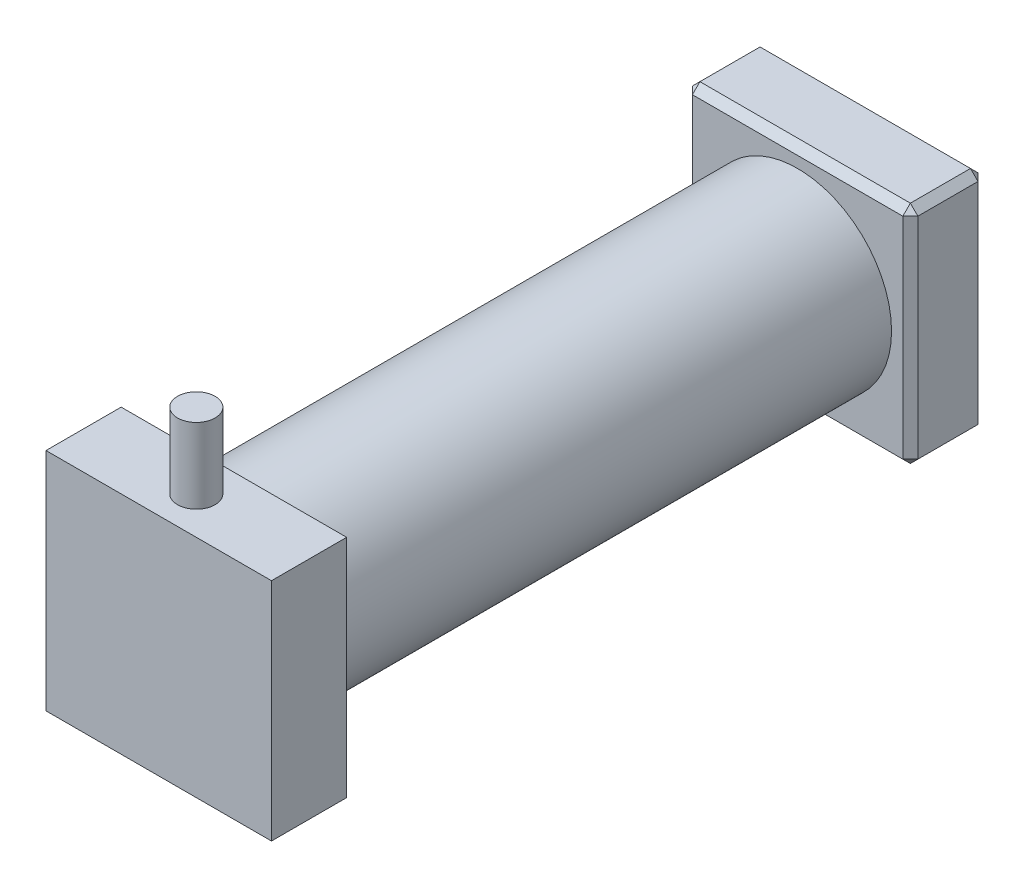
ISO-10303-21;
HEADER;
FILE_DESCRIPTION(('STEP AP214'),'2;1');
FILE_NAME('part.step','',(''),(''),'','','');
FILE_SCHEMA(('AUTOMOTIVE_DESIGN { 1 0 10303 214 1 1 1 1 }'));
ENDSEC;
DATA;
#1=APPLICATION_CONTEXT('core data for automotive mechanical design processes');
#2=APPLICATION_PROTOCOL_DEFINITION('international standard','automotive_design',2000,#1);
#3=PRODUCT_CONTEXT('',#1,'mechanical');
#4=PRODUCT('Part','Part','',(#3));
#5=PRODUCT_RELATED_PRODUCT_CATEGORY('part','',(#4));
#6=PRODUCT_DEFINITION_FORMATION('','',#4);
#7=PRODUCT_DEFINITION_CONTEXT('part definition',#1,'design');
#8=PRODUCT_DEFINITION('design','',#6,#7);
#9=PRODUCT_DEFINITION_SHAPE('','',#8);
#10=(LENGTH_UNIT() NAMED_UNIT(*) SI_UNIT(.MILLI.,.METRE.));
#11=(NAMED_UNIT(*) PLANE_ANGLE_UNIT() SI_UNIT($,.RADIAN.));
#12=(NAMED_UNIT(*) SI_UNIT($,.STERADIAN.) SOLID_ANGLE_UNIT());
#13=UNCERTAINTY_MEASURE_WITH_UNIT(LENGTH_MEASURE(1.E-05),#10,'distance_accuracy_value','');
#14=(GEOMETRIC_REPRESENTATION_CONTEXT(3) GLOBAL_UNCERTAINTY_ASSIGNED_CONTEXT((#13)) GLOBAL_UNIT_ASSIGNED_CONTEXT((#10,
#11,#12)) REPRESENTATION_CONTEXT('',''));
#15=CARTESIAN_POINT('',(0.,0.,0.));
#16=DIRECTION('',(0.,0.,1.));
#17=DIRECTION('',(1.,0.,0.));
#18=AXIS2_PLACEMENT_3D('',#15,#16,#17);
#19=CARTESIAN_POINT('',(0.,0.,150.));
#20=DIRECTION('',(0.,0.,-1.));
#21=DIRECTION('',(-1.,0.,0.));
#22=AXIS2_PLACEMENT_3D('',#19,#20,#21);
#23=CYLINDRICAL_SURFACE('',#22,25.);
#24=CARTESIAN_POINT('',(0.,0.,150.));
#25=DIRECTION('',(0.,0.,1.));
#26=DIRECTION('',(1.,0.,0.));
#27=AXIS2_PLACEMENT_3D('',#24,#25,#26);
#28=CIRCLE('',#27,25.);
#29=CARTESIAN_POINT('',(25.,0.,150.));
#30=VERTEX_POINT('',#29);
#31=EDGE_CURVE('E64',#30,#30,#28,.T.);
#32=ORIENTED_EDGE('',*,*,#31,.F.);
#33=EDGE_LOOP('',(#32));
#34=FACE_BOUND('',#33,.T.);
#35=CARTESIAN_POINT('',(0.,0.,0.));
#36=DIRECTION('',(0.,0.,1.));
#37=DIRECTION('',(1.,0.,0.));
#38=AXIS2_PLACEMENT_3D('',#35,#36,#37);
#39=CIRCLE('',#38,25.);
#40=CARTESIAN_POINT('',(25.,0.,0.));
#41=VERTEX_POINT('',#40);
#42=EDGE_CURVE('E60',#41,#41,#39,.T.);
#43=ORIENTED_EDGE('',*,*,#42,.T.);
#44=EDGE_LOOP('',(#43));
#45=FACE_BOUND('',#44,.T.);
#46=ADVANCED_FACE('F52',(#34,#45),#23,.T.);
#47=CARTESIAN_POINT('',(30.,-30.,170.));
#48=DIRECTION('',(-1.,0.,0.));
#49=DIRECTION('',(0.,0.,1.));
#50=AXIS2_PLACEMENT_3D('',#47,#48,#49);
#51=PLANE('',#50);
#52=DIRECTION('',(0.,1.,0.));
#53=VECTOR('',#52,1.);
#54=CARTESIAN_POINT('',(30.,-30.,150.));
#55=LINE('',#54,#53);
#56=CARTESIAN_POINT('',(30.,-30.,150.));
#57=VERTEX_POINT('',#56);
#58=CARTESIAN_POINT('',(30.,30.,150.));
#59=VERTEX_POINT('',#58);
#60=EDGE_CURVE('E121',#57,#59,#55,.T.);
#61=ORIENTED_EDGE('',*,*,#60,.T.);
#62=DIRECTION('',(0.,0.,-1.));
#63=VECTOR('',#62,1.);
#64=CARTESIAN_POINT('',(30.,30.,170.));
#65=LINE('',#64,#63);
#66=CARTESIAN_POINT('',(30.,30.,170.));
#67=VERTEX_POINT('',#66);
#68=EDGE_CURVE('E108',#67,#59,#65,.T.);
#69=ORIENTED_EDGE('',*,*,#68,.F.);
#70=DIRECTION('',(0.,1.,0.));
#71=VECTOR('',#70,1.);
#72=CARTESIAN_POINT('',(30.,-30.,170.));
#73=LINE('',#72,#71);
#74=CARTESIAN_POINT('',(30.,-30.,170.));
#75=VERTEX_POINT('',#74);
#76=EDGE_CURVE('E130',#75,#67,#73,.T.);
#77=ORIENTED_EDGE('',*,*,#76,.F.);
#78=DIRECTION('',(0.,0.,-1.));
#79=VECTOR('',#78,1.);
#80=CARTESIAN_POINT('',(30.,-30.,170.));
#81=LINE('',#80,#79);
#82=EDGE_CURVE('E112',#75,#57,#81,.T.);
#83=ORIENTED_EDGE('',*,*,#82,.T.);
#84=EDGE_LOOP('',(#61,#69,#77,#83));
#85=FACE_BOUND('',#84,.T.);
#86=ADVANCED_FACE('F134',(#85),#51,.F.);
#87=CARTESIAN_POINT('',(-30.,30.,170.));
#88=DIRECTION('',(0.,-1.,0.));
#89=DIRECTION('',(0.,0.,-1.));
#90=AXIS2_PLACEMENT_3D('',#87,#88,#89);
#91=PLANE('',#90);
#92=CARTESIAN_POINT('',(0.,30.,160.));
#93=DIRECTION('',(0.,1.,0.));
#94=DIRECTION('',(0.,0.,1.));
#95=AXIS2_PLACEMENT_3D('',#92,#93,#94);
#96=CIRCLE('',#95,5.);
#97=CARTESIAN_POINT('',(0.,30.,165.));
#98=VERTEX_POINT('',#97);
#99=EDGE_CURVE('E12',#98,#98,#96,.T.);
#100=ORIENTED_EDGE('',*,*,#99,.F.);
#101=EDGE_LOOP('',(#100));
#102=FACE_BOUND('',#101,.T.);
#103=DIRECTION('',(-1.,0.,0.));
#104=VECTOR('',#103,1.);
#105=CARTESIAN_POINT('',(-30.,30.,150.));
#106=LINE('',#105,#104);
#107=CARTESIAN_POINT('',(-30.,30.,150.));
#108=VERTEX_POINT('',#107);
#109=EDGE_CURVE('E75',#59,#108,#106,.T.);
#110=ORIENTED_EDGE('',*,*,#109,.T.);
#111=DIRECTION('',(0.,0.,-1.));
#112=VECTOR('',#111,1.);
#113=CARTESIAN_POINT('',(-30.,30.,170.));
#114=LINE('',#113,#112);
#115=CARTESIAN_POINT('',(-30.,30.,170.));
#116=VERTEX_POINT('',#115);
#117=EDGE_CURVE('E106',#116,#108,#114,.T.);
#118=ORIENTED_EDGE('',*,*,#117,.F.);
#119=DIRECTION('',(-1.,0.,0.));
#120=VECTOR('',#119,1.);
#121=CARTESIAN_POINT('',(-30.,30.,170.));
#122=LINE('',#121,#120);
#123=EDGE_CURVE('E86',#67,#116,#122,.T.);
#124=ORIENTED_EDGE('',*,*,#123,.F.);
#125=ORIENTED_EDGE('',*,*,#68,.T.);
#126=EDGE_LOOP('',(#110,#118,#124,#125));
#127=FACE_BOUND('',#126,.T.);
#128=ADVANCED_FACE('F104',(#102,#127),#91,.F.);
#129=CARTESIAN_POINT('',(-30.,-30.,170.));
#130=DIRECTION('',(1.,0.,0.));
#131=DIRECTION('',(0.,0.,-1.));
#132=AXIS2_PLACEMENT_3D('',#129,#130,#131);
#133=PLANE('',#132);
#134=DIRECTION('',(0.,-1.,0.));
#135=VECTOR('',#134,1.);
#136=CARTESIAN_POINT('',(-30.,-30.,150.));
#137=LINE('',#136,#135);
#138=CARTESIAN_POINT('',(-30.,-30.,150.));
#139=VERTEX_POINT('',#138);
#140=EDGE_CURVE('E103',#108,#139,#137,.T.);
#141=ORIENTED_EDGE('',*,*,#140,.T.);
#142=DIRECTION('',(0.,0.,-1.));
#143=VECTOR('',#142,1.);
#144=CARTESIAN_POINT('',(-30.,-30.,170.));
#145=LINE('',#144,#143);
#146=CARTESIAN_POINT('',(-30.,-30.,170.));
#147=VERTEX_POINT('',#146);
#148=EDGE_CURVE('E126',#147,#139,#145,.T.);
#149=ORIENTED_EDGE('',*,*,#148,.F.);
#150=DIRECTION('',(0.,-1.,0.));
#151=VECTOR('',#150,1.);
#152=CARTESIAN_POINT('',(-30.,-30.,170.));
#153=LINE('',#152,#151);
#154=EDGE_CURVE('E111',#116,#147,#153,.T.);
#155=ORIENTED_EDGE('',*,*,#154,.F.);
#156=ORIENTED_EDGE('',*,*,#117,.T.);
#157=EDGE_LOOP('',(#141,#149,#155,#156));
#158=FACE_BOUND('',#157,.T.);
#159=ADVANCED_FACE('F114',(#158),#133,.F.);
#160=CARTESIAN_POINT('',(-30.,-30.,170.));
#161=DIRECTION('',(0.,1.,0.));
#162=DIRECTION('',(0.,0.,1.));
#163=AXIS2_PLACEMENT_3D('',#160,#161,#162);
#164=PLANE('',#163);
#165=DIRECTION('',(1.,0.,0.));
#166=VECTOR('',#165,1.);
#167=CARTESIAN_POINT('',(-30.,-30.,150.));
#168=LINE('',#167,#166);
#169=EDGE_CURVE('E100',#139,#57,#168,.T.);
#170=ORIENTED_EDGE('',*,*,#169,.T.);
#171=ORIENTED_EDGE('',*,*,#82,.F.);
#172=DIRECTION('',(1.,0.,0.));
#173=VECTOR('',#172,1.);
#174=CARTESIAN_POINT('',(-30.,-30.,170.));
#175=LINE('',#174,#173);
#176=EDGE_CURVE('E123',#147,#75,#175,.T.);
#177=ORIENTED_EDGE('',*,*,#176,.F.);
#178=ORIENTED_EDGE('',*,*,#148,.T.);
#179=EDGE_LOOP('',(#170,#171,#177,#178));
#180=FACE_BOUND('',#179,.T.);
#181=ADVANCED_FACE('F133',(#180),#164,.F.);
#182=CARTESIAN_POINT('',(0.,0.,170.));
#183=DIRECTION('',(0.,0.,-1.));
#184=DIRECTION('',(-1.,0.,0.));
#185=AXIS2_PLACEMENT_3D('',#182,#183,#184);
#186=PLANE('',#185);
#187=ORIENTED_EDGE('',*,*,#76,.T.);
#188=ORIENTED_EDGE('',*,*,#123,.T.);
#189=ORIENTED_EDGE('',*,*,#154,.T.);
#190=ORIENTED_EDGE('',*,*,#176,.T.);
#191=EDGE_LOOP('',(#187,#188,#189,#190));
#192=FACE_BOUND('',#191,.T.);
#193=ADVANCED_FACE('F135',(#192),#186,.F.);
#194=CARTESIAN_POINT('',(0.,0.,150.));
#195=DIRECTION('',(0.,0.,-1.));
#196=DIRECTION('',(-1.,0.,0.));
#197=AXIS2_PLACEMENT_3D('',#194,#195,#196);
#198=PLANE('',#197);
#199=ORIENTED_EDGE('',*,*,#31,.T.);
#200=EDGE_LOOP('',(#199));
#201=FACE_BOUND('',#200,.T.);
#202=ORIENTED_EDGE('',*,*,#60,.F.);
#203=ORIENTED_EDGE('',*,*,#169,.F.);
#204=ORIENTED_EDGE('',*,*,#140,.F.);
#205=ORIENTED_EDGE('',*,*,#109,.F.);
#206=EDGE_LOOP('',(#202,#203,#204,#205));
#207=FACE_BOUND('',#206,.T.);
#208=ADVANCED_FACE('F116',(#201,#207),#198,.T.);
#209=CARTESIAN_POINT('',(0.,0.,0.));
#210=DIRECTION('',(0.,0.,1.));
#211=DIRECTION('',(1.,0.,0.));
#212=AXIS2_PLACEMENT_3D('',#209,#210,#211);
#213=PLANE('',#212);
#214=ORIENTED_EDGE('',*,*,#42,.F.);
#215=EDGE_LOOP('',(#214));
#216=FACE_BOUND('',#215,.T.);
#217=ADVANCED_FACE('F54',(#216),#213,.F.);
#218=CARTESIAN_POINT('',(0.,50.,160.));
#219=DIRECTION('',(0.,-1.,0.));
#220=DIRECTION('',(0.,0.,-1.));
#221=AXIS2_PLACEMENT_3D('',#218,#219,#220);
#222=CYLINDRICAL_SURFACE('',#221,5.);
#223=CARTESIAN_POINT('',(0.,50.,160.));
#224=DIRECTION('',(0.,1.,0.));
#225=DIRECTION('',(0.,0.,1.));
#226=AXIS2_PLACEMENT_3D('',#223,#224,#225);
#227=CIRCLE('',#226,5.);
#228=CARTESIAN_POINT('',(0.,50.,165.));
#229=VERTEX_POINT('',#228);
#230=EDGE_CURVE('E215',#229,#229,#227,.T.);
#231=ORIENTED_EDGE('',*,*,#230,.F.);
#232=EDGE_LOOP('',(#231));
#233=FACE_BOUND('',#232,.T.);
#234=ORIENTED_EDGE('',*,*,#99,.T.);
#235=EDGE_LOOP('',(#234));
#236=FACE_BOUND('',#235,.T.);
#237=ADVANCED_FACE('F152',(#233,#236),#222,.T.);
#238=CARTESIAN_POINT('',(0.,50.,160.));
#239=DIRECTION('',(0.,1.,0.));
#240=DIRECTION('',(0.,0.,1.));
#241=AXIS2_PLACEMENT_3D('',#238,#239,#240);
#242=PLANE('',#241);
#243=ORIENTED_EDGE('',*,*,#230,.T.);
#244=EDGE_LOOP('',(#243));
#245=FACE_BOUND('',#244,.T.);
#246=ADVANCED_FACE('F200',(#245),#242,.T.);
#247=CLOSED_SHELL('',(#46,#86,#128,#159,#181,#193,#208,#217,#237,#246));
#248=MANIFOLD_SOLID_BREP('B2',#247);
#249=CARTESIAN_POINT('',(-30.,-30.,-20.));
#250=DIRECTION('',(0.,-1.,0.));
#251=DIRECTION('',(0.,0.,-1.));
#252=AXIS2_PLACEMENT_3D('',#249,#250,#251);
#253=PLANE('',#252);
#254=DIRECTION('',(-1.,0.,0.));
#255=VECTOR('',#254,1.);
#256=CARTESIAN_POINT('',(-30.,-30.,-2.00000000000002));
#257=LINE('',#256,#255);
#258=CARTESIAN_POINT('',(28.,-30.,-2.00000000000002));
#259=VERTEX_POINT('',#258);
#260=CARTESIAN_POINT('',(-28.,-30.,-2.00000000000002));
#261=VERTEX_POINT('',#260);
#262=EDGE_CURVE('E357',#259,#261,#257,.T.);
#263=ORIENTED_EDGE('',*,*,#262,.T.);
#264=DIRECTION('',(0.,0.,-1.));
#265=VECTOR('',#264,1.);
#266=CARTESIAN_POINT('',(-28.,-30.,-20.));
#267=LINE('',#266,#265);
#268=CARTESIAN_POINT('',(-28.,-30.,-18.));
#269=VERTEX_POINT('',#268);
#270=EDGE_CURVE('E358',#261,#269,#267,.T.);
#271=ORIENTED_EDGE('',*,*,#270,.T.);
#272=DIRECTION('',(1.,0.,0.));
#273=VECTOR('',#272,1.);
#274=CARTESIAN_POINT('',(-30.,-30.,-18.));
#275=LINE('',#274,#273);
#276=CARTESIAN_POINT('',(28.,-30.,-18.));
#277=VERTEX_POINT('',#276);
#278=EDGE_CURVE('E335',#269,#277,#275,.T.);
#279=ORIENTED_EDGE('',*,*,#278,.T.);
#280=DIRECTION('',(0.,0.,1.));
#281=VECTOR('',#280,1.);
#282=CARTESIAN_POINT('',(28.,-30.,-20.));
#283=LINE('',#282,#281);
#284=EDGE_CURVE('E348',#277,#259,#283,.T.);
#285=ORIENTED_EDGE('',*,*,#284,.T.);
#286=EDGE_LOOP('',(#263,#271,#279,#285));
#287=FACE_BOUND('',#286,.T.);
#288=ADVANCED_FACE('F240',(#287),#253,.T.);
#289=CARTESIAN_POINT('',(-30.,-30.,-20.));
#290=DIRECTION('',(-1.,0.,0.));
#291=DIRECTION('',(0.,0.,1.));
#292=AXIS2_PLACEMENT_3D('',#289,#290,#291);
#293=PLANE('',#292);
#294=DIRECTION('',(0.,0.,-1.));
#295=VECTOR('',#294,1.);
#296=CARTESIAN_POINT('',(-30.,28.,-20.));
#297=LINE('',#296,#295);
#298=CARTESIAN_POINT('',(-30.,28.,-2.00000000000002));
#299=VERTEX_POINT('',#298);
#300=CARTESIAN_POINT('',(-30.,28.,-18.));
#301=VERTEX_POINT('',#300);
#302=EDGE_CURVE('E373',#299,#301,#297,.T.);
#303=ORIENTED_EDGE('',*,*,#302,.T.);
#304=DIRECTION('',(0.,-1.,0.));
#305=VECTOR('',#304,1.);
#306=CARTESIAN_POINT('',(-30.,-30.,-18.));
#307=LINE('',#306,#305);
#308=CARTESIAN_POINT('',(-30.,-28.,-18.));
#309=VERTEX_POINT('',#308);
#310=EDGE_CURVE('E377',#301,#309,#307,.T.);
#311=ORIENTED_EDGE('',*,*,#310,.T.);
#312=DIRECTION('',(0.,0.,1.));
#313=VECTOR('',#312,1.);
#314=CARTESIAN_POINT('',(-30.,-28.,-20.));
#315=LINE('',#314,#313);
#316=CARTESIAN_POINT('',(-30.,-28.,-2.00000000000002));
#317=VERTEX_POINT('',#316);
#318=EDGE_CURVE('E380',#309,#317,#315,.T.);
#319=ORIENTED_EDGE('',*,*,#318,.T.);
#320=DIRECTION('',(0.,1.,0.));
#321=VECTOR('',#320,1.);
#322=CARTESIAN_POINT('',(-30.,30.,-2.00000000000002));
#323=LINE('',#322,#321);
#324=EDGE_CURVE('E374',#317,#299,#323,.T.);
#325=ORIENTED_EDGE('',*,*,#324,.T.);
#326=EDGE_LOOP('',(#303,#311,#319,#325));
#327=FACE_BOUND('',#326,.T.);
#328=ADVANCED_FACE('F489',(#327),#293,.T.);
#329=CARTESIAN_POINT('',(-30.,30.,-20.));
#330=DIRECTION('',(0.,1.,0.));
#331=DIRECTION('',(0.,0.,1.));
#332=AXIS2_PLACEMENT_3D('',#329,#330,#331);
#333=PLANE('',#332);
#334=DIRECTION('',(0.,0.,-1.));
#335=VECTOR('',#334,1.);
#336=CARTESIAN_POINT('',(28.,30.,-20.));
#337=LINE('',#336,#335);
#338=CARTESIAN_POINT('',(28.,30.,-2.00000000000002));
#339=VERTEX_POINT('',#338);
#340=CARTESIAN_POINT('',(28.,30.,-18.));
#341=VERTEX_POINT('',#340);
#342=EDGE_CURVE('E385',#339,#341,#337,.T.);
#343=ORIENTED_EDGE('',*,*,#342,.T.);
#344=DIRECTION('',(-1.,0.,0.));
#345=VECTOR('',#344,1.);
#346=CARTESIAN_POINT('',(-30.,30.,-18.));
#347=LINE('',#346,#345);
#348=CARTESIAN_POINT('',(-28.,30.,-18.));
#349=VERTEX_POINT('',#348);
#350=EDGE_CURVE('E389',#341,#349,#347,.T.);
#351=ORIENTED_EDGE('',*,*,#350,.T.);
#352=DIRECTION('',(0.,0.,1.));
#353=VECTOR('',#352,1.);
#354=CARTESIAN_POINT('',(-28.,30.,-20.));
#355=LINE('',#354,#353);
#356=CARTESIAN_POINT('',(-28.,30.,-2.00000000000002));
#357=VERTEX_POINT('',#356);
#358=EDGE_CURVE('E387',#349,#357,#355,.T.);
#359=ORIENTED_EDGE('',*,*,#358,.T.);
#360=DIRECTION('',(1.,0.,0.));
#361=VECTOR('',#360,1.);
#362=CARTESIAN_POINT('',(30.,30.,-2.00000000000002));
#363=LINE('',#362,#361);
#364=EDGE_CURVE('E383',#357,#339,#363,.T.);
#365=ORIENTED_EDGE('',*,*,#364,.T.);
#366=EDGE_LOOP('',(#343,#351,#359,#365));
#367=FACE_BOUND('',#366,.T.);
#368=ADVANCED_FACE('F493',(#367),#333,.T.);
#369=CARTESIAN_POINT('',(0.,0.,-20.));
#370=DIRECTION('',(0.,0.,-1.));
#371=DIRECTION('',(-1.,0.,0.));
#372=AXIS2_PLACEMENT_3D('',#369,#370,#371);
#373=PLANE('',#372);
#374=DIRECTION('',(0.,-1.,0.));
#375=VECTOR('',#374,1.);
#376=CARTESIAN_POINT('',(28.,0.,-20.));
#377=LINE('',#376,#375);
#378=CARTESIAN_POINT('',(28.,28.,-20.));
#379=VERTEX_POINT('',#378);
#380=CARTESIAN_POINT('',(28.,-28.,-20.));
#381=VERTEX_POINT('',#380);
#382=EDGE_CURVE('E361',#379,#381,#377,.T.);
#383=ORIENTED_EDGE('',*,*,#382,.T.);
#384=DIRECTION('',(-1.,0.,0.));
#385=VECTOR('',#384,1.);
#386=CARTESIAN_POINT('',(0.,-28.,-20.));
#387=LINE('',#386,#385);
#388=CARTESIAN_POINT('',(-28.,-28.,-20.));
#389=VERTEX_POINT('',#388);
#390=EDGE_CURVE('E331',#381,#389,#387,.T.);
#391=ORIENTED_EDGE('',*,*,#390,.T.);
#392=DIRECTION('',(0.,1.,0.));
#393=VECTOR('',#392,1.);
#394=CARTESIAN_POINT('',(-28.,0.,-20.));
#395=LINE('',#394,#393);
#396=CARTESIAN_POINT('',(-28.,28.,-20.));
#397=VERTEX_POINT('',#396);
#398=EDGE_CURVE('E367',#389,#397,#395,.T.);
#399=ORIENTED_EDGE('',*,*,#398,.T.);
#400=DIRECTION('',(1.,0.,0.));
#401=VECTOR('',#400,1.);
#402=CARTESIAN_POINT('',(0.,28.,-20.));
#403=LINE('',#402,#401);
#404=EDGE_CURVE('E366',#397,#379,#403,.T.);
#405=ORIENTED_EDGE('',*,*,#404,.T.);
#406=EDGE_LOOP('',(#383,#391,#399,#405));
#407=FACE_BOUND('',#406,.T.);
#408=CARTESIAN_POINT('',(0.,0.,-20.));
#409=DIRECTION('',(0.,0.,1.));
#410=DIRECTION('',(1.,0.,0.));
#411=AXIS2_PLACEMENT_3D('',#408,#409,#410);
#412=CIRCLE('',#411,25.);
#413=CARTESIAN_POINT('',(25.,0.,-20.));
#414=VERTEX_POINT('',#413);
#415=EDGE_CURVE('E459',#414,#414,#412,.T.);
#416=ORIENTED_EDGE('',*,*,#415,.T.);
#417=EDGE_LOOP('',(#416));
#418=FACE_BOUND('',#417,.T.);
#419=ADVANCED_FACE('F482',(#407,#418),#373,.T.);
#420=CARTESIAN_POINT('',(30.,-30.,-20.));
#421=DIRECTION('',(1.,0.,0.));
#422=DIRECTION('',(0.,0.,-1.));
#423=AXIS2_PLACEMENT_3D('',#420,#421,#422);
#424=PLANE('',#423);
#425=DIRECTION('',(0.,0.,-1.));
#426=VECTOR('',#425,1.);
#427=CARTESIAN_POINT('',(30.,-28.,-20.));
#428=LINE('',#427,#426);
#429=CARTESIAN_POINT('',(30.,-28.,-2.));
#430=VERTEX_POINT('',#429);
#431=CARTESIAN_POINT('',(30.,-28.,-18.));
#432=VERTEX_POINT('',#431);
#433=EDGE_CURVE('E395',#430,#432,#428,.T.);
#434=ORIENTED_EDGE('',*,*,#433,.T.);
#435=DIRECTION('',(0.,1.,0.));
#436=VECTOR('',#435,1.);
#437=CARTESIAN_POINT('',(30.,-30.,-18.));
#438=LINE('',#437,#436);
#439=CARTESIAN_POINT('',(30.,28.,-18.));
#440=VERTEX_POINT('',#439);
#441=EDGE_CURVE('E396',#432,#440,#438,.T.);
#442=ORIENTED_EDGE('',*,*,#441,.T.);
#443=DIRECTION('',(0.,0.,1.));
#444=VECTOR('',#443,1.);
#445=CARTESIAN_POINT('',(30.,28.,-20.));
#446=LINE('',#445,#444);
#447=CARTESIAN_POINT('',(30.,28.,-2.));
#448=VERTEX_POINT('',#447);
#449=EDGE_CURVE('E391',#440,#448,#446,.T.);
#450=ORIENTED_EDGE('',*,*,#449,.T.);
#451=DIRECTION('',(0.,-1.,0.));
#452=VECTOR('',#451,1.);
#453=CARTESIAN_POINT('',(30.,-30.,-2.));
#454=LINE('',#453,#452);
#455=EDGE_CURVE('E394',#448,#430,#454,.T.);
#456=ORIENTED_EDGE('',*,*,#455,.T.);
#457=EDGE_LOOP('',(#434,#442,#450,#456));
#458=FACE_BOUND('',#457,.T.);
#459=ADVANCED_FACE('F478',(#458),#424,.T.);
#460=CARTESIAN_POINT('',(0.,0.,0.));
#461=DIRECTION('',(0.,0.,-1.));
#462=DIRECTION('',(-1.,0.,0.));
#463=AXIS2_PLACEMENT_3D('',#460,#461,#462);
#464=PLANE('',#463);
#465=DIRECTION('',(0.,-1.,0.));
#466=VECTOR('',#465,1.);
#467=CARTESIAN_POINT('',(-28.,-30.,0.));
#468=LINE('',#467,#466);
#469=CARTESIAN_POINT('',(-28.,28.,0.));
#470=VERTEX_POINT('',#469);
#471=CARTESIAN_POINT('',(-28.,-28.,0.));
#472=VERTEX_POINT('',#471);
#473=EDGE_CURVE('E250',#470,#472,#468,.T.);
#474=ORIENTED_EDGE('',*,*,#473,.T.);
#475=DIRECTION('',(1.,0.,0.));
#476=VECTOR('',#475,1.);
#477=CARTESIAN_POINT('',(30.,-28.,0.));
#478=LINE('',#477,#476);
#479=CARTESIAN_POINT('',(28.,-28.,0.));
#480=VERTEX_POINT('',#479);
#481=EDGE_CURVE('E51',#472,#480,#478,.T.);
#482=ORIENTED_EDGE('',*,*,#481,.T.);
#483=DIRECTION('',(0.,1.,0.));
#484=VECTOR('',#483,1.);
#485=CARTESIAN_POINT('',(28.,30.,0.));
#486=LINE('',#485,#484);
#487=CARTESIAN_POINT('',(28.,28.,0.));
#488=VERTEX_POINT('',#487);
#489=EDGE_CURVE('E397',#480,#488,#486,.T.);
#490=ORIENTED_EDGE('',*,*,#489,.T.);
#491=DIRECTION('',(-1.,0.,0.));
#492=VECTOR('',#491,1.);
#493=CARTESIAN_POINT('',(-30.,28.,0.));
#494=LINE('',#493,#492);
#495=EDGE_CURVE('E256',#488,#470,#494,.T.);
#496=ORIENTED_EDGE('',*,*,#495,.T.);
#497=EDGE_LOOP('',(#474,#482,#490,#496));
#498=FACE_BOUND('',#497,.T.);
#499=CARTESIAN_POINT('',(0.,0.,0.));
#500=DIRECTION('',(0.,0.,1.));
#501=DIRECTION('',(1.,0.,0.));
#502=AXIS2_PLACEMENT_3D('',#499,#500,#501);
#503=CIRCLE('',#502,25.);
#504=CARTESIAN_POINT('',(25.,0.,0.));
#505=VERTEX_POINT('',#504);
#506=EDGE_CURVE('E360',#505,#505,#503,.T.);
#507=ORIENTED_EDGE('',*,*,#506,.F.);
#508=EDGE_LOOP('',(#507));
#509=FACE_BOUND('',#508,.T.);
#510=ADVANCED_FACE('F475',(#498,#509),#464,.F.);
#511=CARTESIAN_POINT('',(0.,0.,0.));
#512=DIRECTION('',(0.,0.,-1.));
#513=DIRECTION('',(-1.,0.,0.));
#514=AXIS2_PLACEMENT_3D('',#511,#512,#513);
#515=CYLINDRICAL_SURFACE('',#514,25.);
#516=ORIENTED_EDGE('',*,*,#506,.T.);
#517=EDGE_LOOP('',(#516));
#518=FACE_BOUND('',#517,.T.);
#519=ORIENTED_EDGE('',*,*,#415,.F.);
#520=EDGE_LOOP('',(#519));
#521=FACE_BOUND('',#520,.T.);
#522=ADVANCED_FACE('F473',(#518,#521),#515,.F.);
#523=CARTESIAN_POINT('',(0.,28.,0.));
#524=DIRECTION('',(0.,0.707106781186551,0.707106781186544));
#525=DIRECTION('',(1.,0.,0.));
#526=AXIS2_PLACEMENT_3D('',#523,#524,#525);
#527=PLANE('',#526);
#528=DIRECTION('',(0.,0.707106781186544,-0.707106781186551));
#529=VECTOR('',#528,1.);
#530=CARTESIAN_POINT('',(-28.,29.,-1.00000000000001));
#531=LINE('',#530,#529);
#532=EDGE_CURVE('E242',#470,#357,#531,.T.);
#533=ORIENTED_EDGE('',*,*,#532,.F.);
#534=ORIENTED_EDGE('',*,*,#495,.F.);
#535=DIRECTION('',(0.,-0.707106781186544,0.707106781186551));
#536=VECTOR('',#535,1.);
#537=CARTESIAN_POINT('',(28.,30.,-2.00000000000002));
#538=LINE('',#537,#536);
#539=EDGE_CURVE('E451',#339,#488,#538,.T.);
#540=ORIENTED_EDGE('',*,*,#539,.F.);
#541=ORIENTED_EDGE('',*,*,#364,.F.);
#542=EDGE_LOOP('',(#533,#534,#540,#541));
#543=FACE_BOUND('',#542,.T.);
#544=ADVANCED_FACE('F238',(#543),#527,.T.);
#545=CARTESIAN_POINT('',(-30.,28.,-2.00000000000002));
#546=DIRECTION('',(-0.577350269189626,0.577350269189632,0.57735026918962));
#547=DIRECTION('',(-0.707106781186551,-0.707106781186544,0.));
#548=AXIS2_PLACEMENT_3D('',#545,#546,#547);
#549=PLANE('',#548);
#550=DIRECTION('',(0.707106781186544,0.,0.707106781186551));
#551=VECTOR('',#550,1.);
#552=CARTESIAN_POINT('',(-30.,28.,-2.00000000000002));
#553=LINE('',#552,#551);
#554=EDGE_CURVE('E447',#470,#299,#553,.F.);
#555=ORIENTED_EDGE('',*,*,#554,.F.);
#556=ORIENTED_EDGE('',*,*,#532,.T.);
#557=DIRECTION('',(0.707106781186551,0.707106781186544,0.));
#558=VECTOR('',#557,1.);
#559=CARTESIAN_POINT('',(-30.,28.,-2.00000000000002));
#560=LINE('',#559,#558);
#561=EDGE_CURVE('E450',#299,#357,#560,.T.);
#562=ORIENTED_EDGE('',*,*,#561,.F.);
#563=EDGE_LOOP('',(#555,#556,#562));
#564=FACE_BOUND('',#563,.T.);
#565=ADVANCED_FACE('F617',(#564),#549,.T.);
#566=CARTESIAN_POINT('',(28.,30.,-2.00000000000002));
#567=DIRECTION('',(0.57735026918962,0.577350269189632,0.577350269189626));
#568=DIRECTION('',(0.,-0.707106781186544,0.707106781186551));
#569=AXIS2_PLACEMENT_3D('',#566,#567,#568);
#570=PLANE('',#569);
#571=DIRECTION('',(0.707106781186551,-0.707106781186544,0.));
#572=VECTOR('',#571,1.);
#573=CARTESIAN_POINT('',(28.,30.,-2.00000000000002));
#574=LINE('',#573,#572);
#575=EDGE_CURVE('E442',#339,#448,#574,.T.);
#576=ORIENTED_EDGE('',*,*,#575,.F.);
#577=ORIENTED_EDGE('',*,*,#539,.T.);
#578=DIRECTION('',(0.707106781186551,0.,-0.707106781186544));
#579=VECTOR('',#578,1.);
#580=CARTESIAN_POINT('',(29.,28.,-1.));
#581=LINE('',#580,#579);
#582=EDGE_CURVE('E441',#448,#488,#581,.F.);
#583=ORIENTED_EDGE('',*,*,#582,.F.);
#584=EDGE_LOOP('',(#576,#577,#583));
#585=FACE_BOUND('',#584,.T.);
#586=ADVANCED_FACE('F613',(#585),#570,.T.);
#587=CARTESIAN_POINT('',(-28.,30.,-20.));
#588=DIRECTION('',(0.707106781186544,-0.707106781186551,0.));
#589=DIRECTION('',(0.,0.,1.));
#590=AXIS2_PLACEMENT_3D('',#587,#588,#589);
#591=PLANE('',#590);
#592=ORIENTED_EDGE('',*,*,#561,.T.);
#593=ORIENTED_EDGE('',*,*,#358,.F.);
#594=DIRECTION('',(-0.707106781186551,-0.707106781186544,0.));
#595=VECTOR('',#594,1.);
#596=CARTESIAN_POINT('',(-29.,29.,-18.));
#597=LINE('',#596,#595);
#598=EDGE_CURVE('E436',#301,#349,#597,.F.);
#599=ORIENTED_EDGE('',*,*,#598,.F.);
#600=ORIENTED_EDGE('',*,*,#302,.F.);
#601=EDGE_LOOP('',(#592,#593,#599,#600));
#602=FACE_BOUND('',#601,.T.);
#603=ADVANCED_FACE('F610',(#602),#591,.F.);
#604=CARTESIAN_POINT('',(-28.,0.,0.));
#605=DIRECTION('',(-0.707106781186551,0.,0.707106781186544));
#606=DIRECTION('',(0.,1.,0.));
#607=AXIS2_PLACEMENT_3D('',#604,#605,#606);
#608=PLANE('',#607);
#609=ORIENTED_EDGE('',*,*,#554,.T.);
#610=ORIENTED_EDGE('',*,*,#324,.F.);
#611=DIRECTION('',(-0.707106781186544,0.,-0.707106781186551));
#612=VECTOR('',#611,1.);
#613=CARTESIAN_POINT('',(-29.,-28.,-1.00000000000001));
#614=LINE('',#613,#612);
#615=EDGE_CURVE('E433',#472,#317,#614,.T.);
#616=ORIENTED_EDGE('',*,*,#615,.F.);
#617=ORIENTED_EDGE('',*,*,#473,.F.);
#618=EDGE_LOOP('',(#609,#610,#616,#617));
#619=FACE_BOUND('',#618,.T.);
#620=ADVANCED_FACE('F599',(#619),#608,.T.);
#621=CARTESIAN_POINT('',(0.,-28.,0.));
#622=DIRECTION('',(0.,-0.707106781186551,0.707106781186544));
#623=DIRECTION('',(-1.,0.,0.));
#624=AXIS2_PLACEMENT_3D('',#621,#622,#623);
#625=PLANE('',#624);
#626=DIRECTION('',(0.,-0.707106781186544,-0.707106781186551));
#627=VECTOR('',#626,1.);
#628=CARTESIAN_POINT('',(28.,-28.,0.));
#629=LINE('',#628,#627);
#630=EDGE_CURVE('E430',#480,#259,#629,.T.);
#631=ORIENTED_EDGE('',*,*,#630,.F.);
#632=ORIENTED_EDGE('',*,*,#481,.F.);
#633=DIRECTION('',(0.,0.707106781186544,0.707106781186551));
#634=VECTOR('',#633,1.);
#635=CARTESIAN_POINT('',(-28.,-30.,-2.00000000000002));
#636=LINE('',#635,#634);
#637=EDGE_CURVE('E429',#261,#472,#636,.T.);
#638=ORIENTED_EDGE('',*,*,#637,.F.);
#639=ORIENTED_EDGE('',*,*,#262,.F.);
#640=EDGE_LOOP('',(#631,#632,#638,#639));
#641=FACE_BOUND('',#640,.T.);
#642=ADVANCED_FACE('F593',(#641),#625,.T.);
#643=CARTESIAN_POINT('',(28.,0.,0.));
#644=DIRECTION('',(0.707106781186544,0.,0.707106781186551));
#645=DIRECTION('',(0.,-1.,0.));
#646=AXIS2_PLACEMENT_3D('',#643,#644,#645);
#647=PLANE('',#646);
#648=ORIENTED_EDGE('',*,*,#582,.T.);
#649=ORIENTED_EDGE('',*,*,#489,.F.);
#650=DIRECTION('',(-0.707106781186551,0.,0.707106781186544));
#651=VECTOR('',#650,1.);
#652=CARTESIAN_POINT('',(28.,-28.,0.));
#653=LINE('',#652,#651);
#654=EDGE_CURVE('E422',#430,#480,#653,.T.);
#655=ORIENTED_EDGE('',*,*,#654,.F.);
#656=ORIENTED_EDGE('',*,*,#455,.F.);
#657=EDGE_LOOP('',(#648,#649,#655,#656));
#658=FACE_BOUND('',#657,.T.);
#659=ADVANCED_FACE('F588',(#658),#647,.T.);
#660=CARTESIAN_POINT('',(30.,28.,-20.));
#661=DIRECTION('',(-0.707106781186544,-0.707106781186551,0.));
#662=DIRECTION('',(0.,0.,1.));
#663=AXIS2_PLACEMENT_3D('',#660,#661,#662);
#664=PLANE('',#663);
#665=ORIENTED_EDGE('',*,*,#575,.T.);
#666=ORIENTED_EDGE('',*,*,#449,.F.);
#667=DIRECTION('',(-0.707106781186551,0.707106781186544,0.));
#668=VECTOR('',#667,1.);
#669=CARTESIAN_POINT('',(29.,29.,-18.));
#670=LINE('',#669,#668);
#671=EDGE_CURVE('E425',#341,#440,#670,.F.);
#672=ORIENTED_EDGE('',*,*,#671,.F.);
#673=ORIENTED_EDGE('',*,*,#342,.F.);
#674=EDGE_LOOP('',(#665,#666,#672,#673));
#675=FACE_BOUND('',#674,.T.);
#676=ADVANCED_FACE('F576',(#675),#664,.F.);
#677=CARTESIAN_POINT('',(-30.,30.,-18.));
#678=DIRECTION('',(0.,-0.707106781186551,0.707106781186544));
#679=DIRECTION('',(-1.,0.,0.));
#680=AXIS2_PLACEMENT_3D('',#677,#678,#679);
#681=PLANE('',#680);
#682=DIRECTION('',(0.,0.707106781186544,0.707106781186551));
#683=VECTOR('',#682,1.);
#684=CARTESIAN_POINT('',(-28.,28.,-20.));
#685=LINE('',#684,#683);
#686=EDGE_CURVE('E437',#349,#397,#685,.F.);
#687=ORIENTED_EDGE('',*,*,#686,.F.);
#688=ORIENTED_EDGE('',*,*,#350,.F.);
#689=DIRECTION('',(0.,-0.707106781186544,-0.707106781186551));
#690=VECTOR('',#689,1.);
#691=CARTESIAN_POINT('',(28.,28.,-20.));
#692=LINE('',#691,#690);
#693=EDGE_CURVE('E420',#379,#341,#692,.F.);
#694=ORIENTED_EDGE('',*,*,#693,.F.);
#695=ORIENTED_EDGE('',*,*,#404,.F.);
#696=EDGE_LOOP('',(#687,#688,#694,#695));
#697=FACE_BOUND('',#696,.T.);
#698=ADVANCED_FACE('F572',(#697),#681,.F.);
#699=CARTESIAN_POINT('',(-28.,28.,-20.));
#700=DIRECTION('',(-0.57735026918962,0.577350269189632,-0.577350269189626));
#701=DIRECTION('',(0.,0.707106781186544,0.707106781186551));
#702=AXIS2_PLACEMENT_3D('',#699,#700,#701);
#703=PLANE('',#702);
#704=ORIENTED_EDGE('',*,*,#598,.T.);
#705=ORIENTED_EDGE('',*,*,#686,.T.);
#706=DIRECTION('',(0.707106781186551,0.,-0.707106781186544));
#707=VECTOR('',#706,1.);
#708=CARTESIAN_POINT('',(-28.,28.,-20.));
#709=LINE('',#708,#707);
#710=EDGE_CURVE('E418',#301,#397,#709,.T.);
#711=ORIENTED_EDGE('',*,*,#710,.F.);
#712=EDGE_LOOP('',(#704,#705,#711));
#713=FACE_BOUND('',#712,.T.);
#714=ADVANCED_FACE('F562',(#713),#703,.T.);
#715=CARTESIAN_POINT('',(-28.,-30.,-2.00000000000002));
#716=DIRECTION('',(-0.577350269189626,-0.577350269189632,0.57735026918962));
#717=DIRECTION('',(0.707106781186551,-0.707106781186544,0.));
#718=AXIS2_PLACEMENT_3D('',#715,#716,#717);
#719=PLANE('',#718);
#720=ORIENTED_EDGE('',*,*,#637,.T.);
#721=ORIENTED_EDGE('',*,*,#615,.T.);
#722=DIRECTION('',(-0.707106781186551,0.707106781186544,0.));
#723=VECTOR('',#722,1.);
#724=CARTESIAN_POINT('',(-28.,-30.,-2.00000000000002));
#725=LINE('',#724,#723);
#726=EDGE_CURVE('E414',#261,#317,#725,.T.);
#727=ORIENTED_EDGE('',*,*,#726,.F.);
#728=EDGE_LOOP('',(#720,#721,#727));
#729=FACE_BOUND('',#728,.T.);
#730=ADVANCED_FACE('F559',(#729),#719,.T.);
#731=CARTESIAN_POINT('',(28.,-28.,0.));
#732=DIRECTION('',(0.57735026918962,-0.577350269189632,0.577350269189626));
#733=DIRECTION('',(0.,-0.707106781186544,-0.707106781186551));
#734=AXIS2_PLACEMENT_3D('',#731,#732,#733);
#735=PLANE('',#734);
#736=ORIENTED_EDGE('',*,*,#654,.T.);
#737=ORIENTED_EDGE('',*,*,#630,.T.);
#738=DIRECTION('',(-0.707106781186551,-0.707106781186544,0.));
#739=VECTOR('',#738,1.);
#740=CARTESIAN_POINT('',(29.,-29.,-2.00000000000001));
#741=LINE('',#740,#739);
#742=EDGE_CURVE('E354',#430,#259,#741,.T.);
#743=ORIENTED_EDGE('',*,*,#742,.F.);
#744=EDGE_LOOP('',(#736,#737,#743));
#745=FACE_BOUND('',#744,.T.);
#746=ADVANCED_FACE('F552',(#745),#735,.T.);
#747=CARTESIAN_POINT('',(28.,28.,-20.));
#748=DIRECTION('',(0.57735026918962,0.577350269189632,-0.577350269189626));
#749=DIRECTION('',(0.,0.707106781186544,0.707106781186551));
#750=AXIS2_PLACEMENT_3D('',#747,#748,#749);
#751=PLANE('',#750);
#752=ORIENTED_EDGE('',*,*,#693,.T.);
#753=ORIENTED_EDGE('',*,*,#671,.T.);
#754=DIRECTION('',(0.707106781186551,0.,0.707106781186544));
#755=VECTOR('',#754,1.);
#756=CARTESIAN_POINT('',(28.,28.,-20.));
#757=LINE('',#756,#755);
#758=EDGE_CURVE('E410',#379,#440,#757,.T.);
#759=ORIENTED_EDGE('',*,*,#758,.F.);
#760=EDGE_LOOP('',(#752,#753,#759));
#761=FACE_BOUND('',#760,.T.);
#762=ADVANCED_FACE('F542',(#761),#751,.T.);
#763=CARTESIAN_POINT('',(-30.,-30.,-18.));
#764=DIRECTION('',(0.707106781186544,0.,0.707106781186551));
#765=DIRECTION('',(0.,-1.,0.));
#766=AXIS2_PLACEMENT_3D('',#763,#764,#765);
#767=PLANE('',#766);
#768=ORIENTED_EDGE('',*,*,#710,.T.);
#769=ORIENTED_EDGE('',*,*,#398,.F.);
#770=DIRECTION('',(-0.707106781186551,0.,0.707106781186544));
#771=VECTOR('',#770,1.);
#772=CARTESIAN_POINT('',(-28.,-28.,-20.));
#773=LINE('',#772,#771);
#774=EDGE_CURVE('E407',#309,#389,#773,.F.);
#775=ORIENTED_EDGE('',*,*,#774,.F.);
#776=ORIENTED_EDGE('',*,*,#310,.F.);
#777=EDGE_LOOP('',(#768,#769,#775,#776));
#778=FACE_BOUND('',#777,.T.);
#779=ADVANCED_FACE('F540',(#778),#767,.F.);
#780=CARTESIAN_POINT('',(-30.,-28.,-20.));
#781=DIRECTION('',(0.707106781186544,0.707106781186551,0.));
#782=DIRECTION('',(0.,0.,1.));
#783=AXIS2_PLACEMENT_3D('',#780,#781,#782);
#784=PLANE('',#783);
#785=ORIENTED_EDGE('',*,*,#726,.T.);
#786=ORIENTED_EDGE('',*,*,#318,.F.);
#787=DIRECTION('',(0.707106781186551,-0.707106781186544,0.));
#788=VECTOR('',#787,1.);
#789=CARTESIAN_POINT('',(-29.,-29.,-18.));
#790=LINE('',#789,#788);
#791=EDGE_CURVE('E350',#269,#309,#790,.F.);
#792=ORIENTED_EDGE('',*,*,#791,.F.);
#793=ORIENTED_EDGE('',*,*,#270,.F.);
#794=EDGE_LOOP('',(#785,#786,#792,#793));
#795=FACE_BOUND('',#794,.T.);
#796=ADVANCED_FACE('F533',(#795),#784,.F.);
#797=CARTESIAN_POINT('',(28.,-30.,-20.));
#798=DIRECTION('',(-0.707106781186544,0.707106781186551,0.));
#799=DIRECTION('',(0.,0.,1.));
#800=AXIS2_PLACEMENT_3D('',#797,#798,#799);
#801=PLANE('',#800);
#802=ORIENTED_EDGE('',*,*,#742,.T.);
#803=ORIENTED_EDGE('',*,*,#284,.F.);
#804=DIRECTION('',(0.707106781186551,0.707106781186544,0.));
#805=VECTOR('',#804,1.);
#806=CARTESIAN_POINT('',(28.,-30.,-18.));
#807=LINE('',#806,#805);
#808=EDGE_CURVE('E340',#432,#277,#807,.F.);
#809=ORIENTED_EDGE('',*,*,#808,.F.);
#810=ORIENTED_EDGE('',*,*,#433,.F.);
#811=EDGE_LOOP('',(#802,#803,#809,#810));
#812=FACE_BOUND('',#811,.T.);
#813=ADVANCED_FACE('F351',(#812),#801,.F.);
#814=CARTESIAN_POINT('',(30.,-30.,-18.));
#815=DIRECTION('',(-0.707106781186544,0.,0.707106781186551));
#816=DIRECTION('',(0.,1.,0.));
#817=AXIS2_PLACEMENT_3D('',#814,#815,#816);
#818=PLANE('',#817);
#819=ORIENTED_EDGE('',*,*,#758,.T.);
#820=ORIENTED_EDGE('',*,*,#441,.F.);
#821=DIRECTION('',(-0.707106781186551,0.,-0.707106781186544));
#822=VECTOR('',#821,1.);
#823=CARTESIAN_POINT('',(29.,-28.,-19.));
#824=LINE('',#823,#822);
#825=EDGE_CURVE('E343',#381,#432,#824,.F.);
#826=ORIENTED_EDGE('',*,*,#825,.F.);
#827=ORIENTED_EDGE('',*,*,#382,.F.);
#828=EDGE_LOOP('',(#819,#820,#826,#827));
#829=FACE_BOUND('',#828,.T.);
#830=ADVANCED_FACE('F519',(#829),#818,.F.);
#831=CARTESIAN_POINT('',(-28.,-28.,-20.));
#832=DIRECTION('',(-0.57735026918962,-0.577350269189626,-0.577350269189632));
#833=DIRECTION('',(0.,0.707106781186551,-0.707106781186544));
#834=AXIS2_PLACEMENT_3D('',#831,#832,#833);
#835=PLANE('',#834);
#836=ORIENTED_EDGE('',*,*,#791,.T.);
#837=ORIENTED_EDGE('',*,*,#774,.T.);
#838=DIRECTION('',(0.,0.707106781186551,-0.707106781186544));
#839=VECTOR('',#838,1.);
#840=CARTESIAN_POINT('',(-28.,-28.,-20.));
#841=LINE('',#840,#839);
#842=EDGE_CURVE('E337',#269,#389,#841,.T.);
#843=ORIENTED_EDGE('',*,*,#842,.F.);
#844=EDGE_LOOP('',(#836,#837,#843));
#845=FACE_BOUND('',#844,.T.);
#846=ADVANCED_FACE('F515',(#845),#835,.T.);
#847=CARTESIAN_POINT('',(28.,-30.,-18.));
#848=DIRECTION('',(0.57735026918962,-0.577350269189626,-0.577350269189632));
#849=DIRECTION('',(0.,0.707106781186551,-0.707106781186544));
#850=AXIS2_PLACEMENT_3D('',#847,#848,#849);
#851=PLANE('',#850);
#852=ORIENTED_EDGE('',*,*,#825,.T.);
#853=ORIENTED_EDGE('',*,*,#808,.T.);
#854=DIRECTION('',(0.,-0.707106781186551,0.707106781186544));
#855=VECTOR('',#854,1.);
#856=CARTESIAN_POINT('',(28.,-30.,-18.));
#857=LINE('',#856,#855);
#858=EDGE_CURVE('E327',#381,#277,#857,.T.);
#859=ORIENTED_EDGE('',*,*,#858,.F.);
#860=EDGE_LOOP('',(#852,#853,#859));
#861=FACE_BOUND('',#860,.T.);
#862=ADVANCED_FACE('F341',(#861),#851,.T.);
#863=CARTESIAN_POINT('',(-30.,-30.,-18.));
#864=DIRECTION('',(0.,0.707106781186544,0.707106781186551));
#865=DIRECTION('',(1.,0.,0.));
#866=AXIS2_PLACEMENT_3D('',#863,#864,#865);
#867=PLANE('',#866);
#868=ORIENTED_EDGE('',*,*,#842,.T.);
#869=ORIENTED_EDGE('',*,*,#390,.F.);
#870=ORIENTED_EDGE('',*,*,#858,.T.);
#871=ORIENTED_EDGE('',*,*,#278,.F.);
#872=EDGE_LOOP('',(#868,#869,#870,#871));
#873=FACE_BOUND('',#872,.T.);
#874=ADVANCED_FACE('F329',(#873),#867,.F.);
#875=CLOSED_SHELL('',(#288,#328,#368,#419,#459,#510,#522,#544,#565,#586,#603,#620,#642,#659,
#676,#698,#714,#730,#746,#762,#779,#796,#813,#830,#846,#862,#874));
#876=MANIFOLD_SOLID_BREP('B6',#875);
#877=ADVANCED_BREP_SHAPE_REPRESENTATION('',(#18,#248,#876),#14);
#878=SHAPE_DEFINITION_REPRESENTATION(#9,#877);
ENDSEC;
END-ISO-10303-21;
